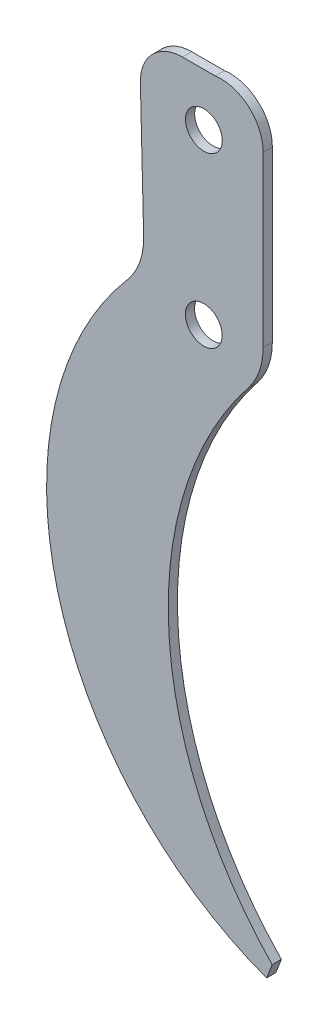
ISO-10303-21;
HEADER;
FILE_DESCRIPTION(('STEP AP214'),'2;1');
FILE_NAME('part.step','',(''),(''),'','','');
FILE_SCHEMA(('AUTOMOTIVE_DESIGN { 1 0 10303 214 1 1 1 1 }'));
ENDSEC;
DATA;
#1=APPLICATION_CONTEXT('core data for automotive mechanical design processes');
#2=APPLICATION_PROTOCOL_DEFINITION('international standard','automotive_design',2000,#1);
#3=PRODUCT_CONTEXT('',#1,'mechanical');
#4=PRODUCT('Part','Part','',(#3));
#5=PRODUCT_RELATED_PRODUCT_CATEGORY('part','',(#4));
#6=PRODUCT_DEFINITION_FORMATION('','',#4);
#7=PRODUCT_DEFINITION_CONTEXT('part definition',#1,'design');
#8=PRODUCT_DEFINITION('design','',#6,#7);
#9=PRODUCT_DEFINITION_SHAPE('','',#8);
#10=(LENGTH_UNIT() NAMED_UNIT(*) SI_UNIT(.MILLI.,.METRE.));
#11=(NAMED_UNIT(*) PLANE_ANGLE_UNIT() SI_UNIT($,.RADIAN.));
#12=(NAMED_UNIT(*) SI_UNIT($,.STERADIAN.) SOLID_ANGLE_UNIT());
#13=UNCERTAINTY_MEASURE_WITH_UNIT(LENGTH_MEASURE(1.E-05),#10,'distance_accuracy_value','');
#14=(GEOMETRIC_REPRESENTATION_CONTEXT(3) GLOBAL_UNCERTAINTY_ASSIGNED_CONTEXT((#13)) GLOBAL_UNIT_ASSIGNED_CONTEXT((#10,
#11,#12)) REPRESENTATION_CONTEXT('',''));
#15=CARTESIAN_POINT('',(0.,0.,0.));
#16=DIRECTION('',(0.,0.,1.));
#17=DIRECTION('',(1.,0.,0.));
#18=AXIS2_PLACEMENT_3D('',#15,#16,#17);
#19=CARTESIAN_POINT('',(7127.77049573772,3294.93047297351,15.));
#20=DIRECTION('',(0.,0.,1.));
#21=DIRECTION('',(1.,0.,0.));
#22=AXIS2_PLACEMENT_3D('',#19,#20,#21);
#23=PLANE('',#22);
#24=CARTESIAN_POINT('',(7127.77049573772,3294.93047297351,15.));
#25=DIRECTION('',(0.,0.,1.));
#26=DIRECTION('',(1.,0.,0.));
#27=AXIS2_PLACEMENT_3D('',#24,#25,#26);
#28=CIRCLE('',#27,549.387659983748);
#29=CARTESIAN_POINT('',(6710.2050521168,3651.95414338778,15.));
#30=VERTEX_POINT('',#29);
#31=CARTESIAN_POINT('',(6936.87895507785,2779.77300127489,15.));
#32=VERTEX_POINT('',#31);
#33=EDGE_CURVE('E162',#30,#32,#28,.T.);
#34=ORIENTED_EDGE('',*,*,#33,.T.);
#35=DIRECTION('',(0.362479633940397,0.931991692547973,0.));
#36=VECTOR('',#35,1.);
#37=CARTESIAN_POINT('',(6945.94094592636,2803.07279358859,15.));
#38=LINE('',#37,#36);
#39=CARTESIAN_POINT('',(6945.94094592636,2803.07279358859,15.));
#40=VERTEX_POINT('',#39);
#41=EDGE_CURVE('E100',#32,#40,#38,.T.);
#42=ORIENTED_EDGE('',*,*,#41,.T.);
#43=CARTESIAN_POINT('',(7380.92244872364,3222.59814605796,15.));
#44=DIRECTION('',(0.,0.,-1.));
#45=DIRECTION('',(1.,0.,0.));
#46=AXIS2_PLACEMENT_3D('',#43,#44,#45);
#47=CIRCLE('',#46,604.326425982123);
#48=CARTESIAN_POINT('',(6907.31914174979,3597.97840228325,15.));
#49=VERTEX_POINT('',#48);
#50=EDGE_CURVE('E183',#40,#49,#47,.T.);
#51=ORIENTED_EDGE('',*,*,#50,.T.);
#52=CARTESIAN_POINT('',(6821.31679547886,3666.36457393798,15.));
#53=DIRECTION('',(0.,0.,1.));
#54=DIRECTION('',(1.,0.,0.));
#55=AXIS2_PLACEMENT_3D('',#52,#53,#54);
#56=CIRCLE('',#55,109.877531996749);
#57=CARTESIAN_POINT('',(6931.19432747561,3666.36457393798,15.));
#58=VERTEX_POINT('',#57);
#59=EDGE_CURVE('E202',#49,#58,#56,.T.);
#60=ORIENTED_EDGE('',*,*,#59,.T.);
#61=DIRECTION('',(0.,1.,0.));
#62=VECTOR('',#61,1.);
#63=CARTESIAN_POINT('',(6931.19432747561,3942.08605991255,15.));
#64=LINE('',#63,#62);
#65=CARTESIAN_POINT('',(6931.19432747561,3942.08605991255,15.));
#66=VERTEX_POINT('',#65);
#67=EDGE_CURVE('E199',#58,#66,#64,.T.);
#68=ORIENTED_EDGE('',*,*,#67,.T.);
#69=CARTESIAN_POINT('',(6862.52400653346,3942.74240313721,15.));
#70=DIRECTION('',(0.,0.,1.));
#71=DIRECTION('',(1.,0.,0.));
#72=AXIS2_PLACEMENT_3D('',#69,#70,#71);
#73=CIRCLE('',#72,68.6734574979682);
#74=CARTESIAN_POINT('',(6853.05215715453,4010.75951741052,15.));
#75=VERTEX_POINT('',#74);
#76=EDGE_CURVE('E201',#66,#75,#73,.T.);
#77=ORIENTED_EDGE('',*,*,#76,.T.);
#78=DIRECTION('',(-1.,0.,0.));
#79=VECTOR('',#78,1.);
#80=CARTESIAN_POINT('',(6799.84646166127,4010.75951741052,15.));
#81=LINE('',#80,#79);
#82=CARTESIAN_POINT('',(6799.84646166127,4010.75951741052,15.));
#83=VERTEX_POINT('',#82);
#84=EDGE_CURVE('E125',#75,#83,#81,.T.);
#85=ORIENTED_EDGE('',*,*,#84,.T.);
#86=CARTESIAN_POINT('',(6799.84646166127,3942.08605991255,15.));
#87=DIRECTION('',(0.,0.,1.));
#88=DIRECTION('',(1.,0.,0.));
#89=AXIS2_PLACEMENT_3D('',#86,#87,#88);
#90=CIRCLE('',#89,68.6734574979682);
#91=CARTESIAN_POINT('',(6731.19432747561,3940.37485084327,15.));
#92=VERTEX_POINT('',#91);
#93=EDGE_CURVE('E119',#83,#92,#90,.T.);
#94=ORIENTED_EDGE('',*,*,#93,.T.);
#95=DIRECTION('',(0.0249180561402347,-0.99968949703305,0.));
#96=VECTOR('',#95,1.);
#97=CARTESIAN_POINT('',(6736.53537808965,3726.09681198145,15.));
#98=LINE('',#97,#96);
#99=CARTESIAN_POINT('',(6736.53537808965,3726.09681198145,15.));
#100=VERTEX_POINT('',#99);
#101=EDGE_CURVE('E123',#92,#100,#98,.T.);
#102=ORIENTED_EDGE('',*,*,#101,.T.);
#103=CARTESIAN_POINT('',(6626.69196339258,3723.3588774706,15.));
#104=DIRECTION('',(0.,0.,-1.));
#105=DIRECTION('',(1.,0.,0.));
#106=AXIS2_PLACEMENT_3D('',#103,#104,#105);
#107=CIRCLE('',#106,109.877531996749);
#108=EDGE_CURVE('E51',#100,#30,#107,.T.);
#109=ORIENTED_EDGE('',*,*,#108,.T.);
#110=EDGE_LOOP('',(#34,#42,#51,#60,#68,#77,#85,#94,#102,#109));
#111=FACE_BOUND('',#110,.T.);
#112=CARTESIAN_POINT('',(6834.46924200168,3650.21863180757,15.));
#113=DIRECTION('',(0.,0.,1.));
#114=DIRECTION('',(1.,0.,0.));
#115=AXIS2_PLACEMENT_3D('',#112,#113,#114);
#116=CIRCLE('',#115,29.9999999999998);
#117=CARTESIAN_POINT('',(6864.46924200168,3650.21863180757,15.));
#118=VERTEX_POINT('',#117);
#119=EDGE_CURVE('E212',#118,#118,#116,.T.);
#120=ORIENTED_EDGE('',*,*,#119,.F.);
#121=EDGE_LOOP('',(#120));
#122=FACE_BOUND('',#121,.T.);
#123=CARTESIAN_POINT('',(6834.63264710738,3925.21863180757,15.));
#124=DIRECTION('',(0.,0.,1.));
#125=DIRECTION('',(1.,0.,0.));
#126=AXIS2_PLACEMENT_3D('',#123,#124,#125);
#127=CIRCLE('',#126,29.9999999999998);
#128=CARTESIAN_POINT('',(6864.63264710738,3925.21863180757,15.));
#129=VERTEX_POINT('',#128);
#130=EDGE_CURVE('E218',#129,#129,#127,.T.);
#131=ORIENTED_EDGE('',*,*,#130,.F.);
#132=EDGE_LOOP('',(#131));
#133=FACE_BOUND('',#132,.T.);
#134=ADVANCED_FACE('F34',(#111,#122,#133),#23,.T.);
#135=CARTESIAN_POINT('',(7127.77049573772,3294.93047297351,0.));
#136=DIRECTION('',(0.,0.,1.));
#137=DIRECTION('',(1.,0.,0.));
#138=AXIS2_PLACEMENT_3D('',#135,#136,#137);
#139=PLANE('',#138);
#140=CARTESIAN_POINT('',(7127.77049573772,3294.93047297351,0.));
#141=DIRECTION('',(0.,0.,1.));
#142=DIRECTION('',(1.,0.,0.));
#143=AXIS2_PLACEMENT_3D('',#140,#141,#142);
#144=CIRCLE('',#143,549.387659983748);
#145=CARTESIAN_POINT('',(6710.2050521168,3651.95414338778,0.));
#146=VERTEX_POINT('',#145);
#147=CARTESIAN_POINT('',(6936.87895507785,2779.77300127489,0.));
#148=VERTEX_POINT('',#147);
#149=EDGE_CURVE('E143',#146,#148,#144,.T.);
#150=ORIENTED_EDGE('',*,*,#149,.F.);
#151=CARTESIAN_POINT('',(6626.69196339258,3723.3588774706,0.));
#152=DIRECTION('',(0.,0.,-1.));
#153=DIRECTION('',(1.,0.,0.));
#154=AXIS2_PLACEMENT_3D('',#151,#152,#153);
#155=CIRCLE('',#154,109.877531996749);
#156=CARTESIAN_POINT('',(6736.53537808965,3726.09681198145,0.));
#157=VERTEX_POINT('',#156);
#158=EDGE_CURVE('E92',#157,#146,#155,.T.);
#159=ORIENTED_EDGE('',*,*,#158,.F.);
#160=DIRECTION('',(0.0249180561402347,-0.99968949703305,0.));
#161=VECTOR('',#160,1.);
#162=CARTESIAN_POINT('',(6736.53537808965,3726.09681198145,0.));
#163=LINE('',#162,#161);
#164=CARTESIAN_POINT('',(6731.19432747561,3940.37485084327,0.));
#165=VERTEX_POINT('',#164);
#166=EDGE_CURVE('E86',#165,#157,#163,.T.);
#167=ORIENTED_EDGE('',*,*,#166,.F.);
#168=CARTESIAN_POINT('',(6799.84646166127,3942.08605991255,0.));
#169=DIRECTION('',(0.,0.,1.));
#170=DIRECTION('',(1.,0.,0.));
#171=AXIS2_PLACEMENT_3D('',#168,#169,#170);
#172=CIRCLE('',#171,68.6734574979682);
#173=CARTESIAN_POINT('',(6799.84646166127,4010.75951741052,0.));
#174=VERTEX_POINT('',#173);
#175=EDGE_CURVE('E133',#174,#165,#172,.T.);
#176=ORIENTED_EDGE('',*,*,#175,.F.);
#177=DIRECTION('',(-1.,0.,0.));
#178=VECTOR('',#177,1.);
#179=CARTESIAN_POINT('',(6799.84646166127,4010.75951741052,0.));
#180=LINE('',#179,#178);
#181=CARTESIAN_POINT('',(6853.05215715453,4010.75951741052,0.));
#182=VERTEX_POINT('',#181);
#183=EDGE_CURVE('E157',#182,#174,#180,.T.);
#184=ORIENTED_EDGE('',*,*,#183,.F.);
#185=CARTESIAN_POINT('',(6862.52400653346,3942.74240313721,0.));
#186=DIRECTION('',(0.,0.,1.));
#187=DIRECTION('',(1.,0.,0.));
#188=AXIS2_PLACEMENT_3D('',#185,#186,#187);
#189=CIRCLE('',#188,68.6734574979682);
#190=CARTESIAN_POINT('',(6931.19432747561,3942.08605991255,0.));
#191=VERTEX_POINT('',#190);
#192=EDGE_CURVE('E155',#191,#182,#189,.T.);
#193=ORIENTED_EDGE('',*,*,#192,.F.);
#194=DIRECTION('',(0.,1.,0.));
#195=VECTOR('',#194,1.);
#196=CARTESIAN_POINT('',(6931.19432747561,3942.08605991255,0.));
#197=LINE('',#196,#195);
#198=CARTESIAN_POINT('',(6931.19432747561,3666.36457393798,0.));
#199=VERTEX_POINT('',#198);
#200=EDGE_CURVE('E153',#199,#191,#197,.T.);
#201=ORIENTED_EDGE('',*,*,#200,.F.);
#202=CARTESIAN_POINT('',(6821.31679547886,3666.36457393798,0.));
#203=DIRECTION('',(0.,0.,1.));
#204=DIRECTION('',(1.,0.,0.));
#205=AXIS2_PLACEMENT_3D('',#202,#203,#204);
#206=CIRCLE('',#205,109.877531996749);
#207=CARTESIAN_POINT('',(6907.31914174979,3597.97840228325,0.));
#208=VERTEX_POINT('',#207);
#209=EDGE_CURVE('E151',#208,#199,#206,.T.);
#210=ORIENTED_EDGE('',*,*,#209,.F.);
#211=CARTESIAN_POINT('',(7380.92244872364,3222.59814605796,0.));
#212=DIRECTION('',(0.,0.,-1.));
#213=DIRECTION('',(1.,0.,0.));
#214=AXIS2_PLACEMENT_3D('',#211,#212,#213);
#215=CIRCLE('',#214,604.326425982123);
#216=CARTESIAN_POINT('',(6945.94094592636,2803.07279358859,0.));
#217=VERTEX_POINT('',#216);
#218=EDGE_CURVE('E149',#217,#208,#215,.T.);
#219=ORIENTED_EDGE('',*,*,#218,.F.);
#220=DIRECTION('',(0.362479633940397,0.931991692547973,0.));
#221=VECTOR('',#220,1.);
#222=CARTESIAN_POINT('',(6945.94094592636,2803.07279358859,0.));
#223=LINE('',#222,#221);
#224=EDGE_CURVE('E146',#148,#217,#223,.T.);
#225=ORIENTED_EDGE('',*,*,#224,.F.);
#226=EDGE_LOOP('',(#150,#159,#167,#176,#184,#193,#201,#210,#219,#225));
#227=FACE_BOUND('',#226,.T.);
#228=CARTESIAN_POINT('',(6834.46924200168,3650.21863180757,0.));
#229=DIRECTION('',(0.,0.,1.));
#230=DIRECTION('',(1.,0.,0.));
#231=AXIS2_PLACEMENT_3D('',#228,#229,#230);
#232=CIRCLE('',#231,29.9999999999998);
#233=CARTESIAN_POINT('',(6864.46924200168,3650.21863180757,0.));
#234=VERTEX_POINT('',#233);
#235=EDGE_CURVE('E147',#234,#234,#232,.F.);
#236=ORIENTED_EDGE('',*,*,#235,.F.);
#237=EDGE_LOOP('',(#236));
#238=FACE_BOUND('',#237,.T.);
#239=CARTESIAN_POINT('',(6834.63264710738,3925.21863180757,0.));
#240=DIRECTION('',(0.,0.,1.));
#241=DIRECTION('',(1.,0.,0.));
#242=AXIS2_PLACEMENT_3D('',#239,#240,#241);
#243=CIRCLE('',#242,29.9999999999998);
#244=CARTESIAN_POINT('',(6864.63264710738,3925.21863180757,0.));
#245=VERTEX_POINT('',#244);
#246=EDGE_CURVE('E215',#245,#245,#243,.F.);
#247=ORIENTED_EDGE('',*,*,#246,.F.);
#248=EDGE_LOOP('',(#247));
#249=FACE_BOUND('',#248,.T.);
#250=ADVANCED_FACE('F187',(#227,#238,#249),#139,.F.);
#251=CARTESIAN_POINT('',(7127.77049573772,3294.93047297351,15.));
#252=DIRECTION('',(0.,0.,-1.));
#253=DIRECTION('',(-1.,0.,0.));
#254=AXIS2_PLACEMENT_3D('',#251,#252,#253);
#255=CYLINDRICAL_SURFACE('',#254,549.387659983748);
#256=ORIENTED_EDGE('',*,*,#149,.T.);
#257=DIRECTION('',(0.,0.,-1.));
#258=VECTOR('',#257,1.);
#259=CARTESIAN_POINT('',(6936.87895507785,2779.77300127489,15.));
#260=LINE('',#259,#258);
#261=EDGE_CURVE('E11',#32,#148,#260,.T.);
#262=ORIENTED_EDGE('',*,*,#261,.F.);
#263=ORIENTED_EDGE('',*,*,#33,.F.);
#264=DIRECTION('',(0.,0.,-1.));
#265=VECTOR('',#264,1.);
#266=CARTESIAN_POINT('',(6710.2050521168,3651.95414338778,15.));
#267=LINE('',#266,#265);
#268=EDGE_CURVE('E139',#30,#146,#267,.T.);
#269=ORIENTED_EDGE('',*,*,#268,.T.);
#270=EDGE_LOOP('',(#256,#262,#263,#269));
#271=FACE_BOUND('',#270,.T.);
#272=ADVANCED_FACE('F36',(#271),#255,.T.);
#273=CARTESIAN_POINT('',(6945.94094592636,2803.07279358859,15.));
#274=DIRECTION('',(-0.931991692547973,0.362479633940397,0.));
#275=DIRECTION('',(-0.362479633940397,-0.931991692547973,0.));
#276=AXIS2_PLACEMENT_3D('',#273,#274,#275);
#277=PLANE('',#276);
#278=ORIENTED_EDGE('',*,*,#224,.T.);
#279=DIRECTION('',(0.,0.,-1.));
#280=VECTOR('',#279,1.);
#281=CARTESIAN_POINT('',(6945.94094592636,2803.07279358859,15.));
#282=LINE('',#281,#280);
#283=EDGE_CURVE('E43',#40,#217,#282,.T.);
#284=ORIENTED_EDGE('',*,*,#283,.F.);
#285=ORIENTED_EDGE('',*,*,#41,.F.);
#286=ORIENTED_EDGE('',*,*,#261,.T.);
#287=EDGE_LOOP('',(#278,#284,#285,#286));
#288=FACE_BOUND('',#287,.T.);
#289=ADVANCED_FACE('F254',(#288),#277,.F.);
#290=CARTESIAN_POINT('',(7380.92244872364,3222.59814605796,15.));
#291=DIRECTION('',(0.,0.,-1.));
#292=DIRECTION('',(-1.,0.,0.));
#293=AXIS2_PLACEMENT_3D('',#290,#291,#292);
#294=CYLINDRICAL_SURFACE('',#293,604.326425982123);
#295=ORIENTED_EDGE('',*,*,#218,.T.);
#296=DIRECTION('',(0.,0.,-1.));
#297=VECTOR('',#296,1.);
#298=CARTESIAN_POINT('',(6907.31914174979,3597.97840228325,15.));
#299=LINE('',#298,#297);
#300=EDGE_CURVE('E175',#49,#208,#299,.T.);
#301=ORIENTED_EDGE('',*,*,#300,.F.);
#302=ORIENTED_EDGE('',*,*,#50,.F.);
#303=ORIENTED_EDGE('',*,*,#283,.T.);
#304=EDGE_LOOP('',(#295,#301,#302,#303));
#305=FACE_BOUND('',#304,.T.);
#306=ADVANCED_FACE('F181',(#305),#294,.F.);
#307=CARTESIAN_POINT('',(6821.31679547886,3666.36457393798,15.));
#308=DIRECTION('',(0.,0.,-1.));
#309=DIRECTION('',(-1.,0.,0.));
#310=AXIS2_PLACEMENT_3D('',#307,#308,#309);
#311=CYLINDRICAL_SURFACE('',#310,109.877531996749);
#312=ORIENTED_EDGE('',*,*,#209,.T.);
#313=DIRECTION('',(0.,0.,-1.));
#314=VECTOR('',#313,1.);
#315=CARTESIAN_POINT('',(6931.19432747561,3666.36457393798,15.));
#316=LINE('',#315,#314);
#317=EDGE_CURVE('E172',#58,#199,#316,.T.);
#318=ORIENTED_EDGE('',*,*,#317,.F.);
#319=ORIENTED_EDGE('',*,*,#59,.F.);
#320=ORIENTED_EDGE('',*,*,#300,.T.);
#321=EDGE_LOOP('',(#312,#318,#319,#320));
#322=FACE_BOUND('',#321,.T.);
#323=ADVANCED_FACE('F193',(#322),#311,.T.);
#324=CARTESIAN_POINT('',(6931.19432747561,3942.08605991255,15.));
#325=DIRECTION('',(-1.,0.,0.));
#326=DIRECTION('',(0.,0.,1.));
#327=AXIS2_PLACEMENT_3D('',#324,#325,#326);
#328=PLANE('',#327);
#329=ORIENTED_EDGE('',*,*,#200,.T.);
#330=DIRECTION('',(0.,0.,-1.));
#331=VECTOR('',#330,1.);
#332=CARTESIAN_POINT('',(6931.19432747561,3942.08605991255,15.));
#333=LINE('',#332,#331);
#334=EDGE_CURVE('E169',#66,#191,#333,.T.);
#335=ORIENTED_EDGE('',*,*,#334,.F.);
#336=ORIENTED_EDGE('',*,*,#67,.F.);
#337=ORIENTED_EDGE('',*,*,#317,.T.);
#338=EDGE_LOOP('',(#329,#335,#336,#337));
#339=FACE_BOUND('',#338,.T.);
#340=ADVANCED_FACE('F197',(#339),#328,.F.);
#341=CARTESIAN_POINT('',(6862.52400653346,3942.74240313721,15.));
#342=DIRECTION('',(0.,0.,-1.));
#343=DIRECTION('',(-1.,0.,0.));
#344=AXIS2_PLACEMENT_3D('',#341,#342,#343);
#345=CYLINDRICAL_SURFACE('',#344,68.6734574979682);
#346=ORIENTED_EDGE('',*,*,#192,.T.);
#347=DIRECTION('',(0.,0.,-1.));
#348=VECTOR('',#347,1.);
#349=CARTESIAN_POINT('',(6853.05215715453,4010.75951741052,15.));
#350=LINE('',#349,#348);
#351=EDGE_CURVE('E166',#75,#182,#350,.T.);
#352=ORIENTED_EDGE('',*,*,#351,.F.);
#353=ORIENTED_EDGE('',*,*,#76,.F.);
#354=ORIENTED_EDGE('',*,*,#334,.T.);
#355=EDGE_LOOP('',(#346,#352,#353,#354));
#356=FACE_BOUND('',#355,.T.);
#357=ADVANCED_FACE('F244',(#356),#345,.T.);
#358=CARTESIAN_POINT('',(6799.84646166127,4010.75951741052,15.));
#359=DIRECTION('',(0.,-1.,0.));
#360=DIRECTION('',(1.,0.,0.));
#361=AXIS2_PLACEMENT_3D('',#358,#359,#360);
#362=PLANE('',#361);
#363=ORIENTED_EDGE('',*,*,#183,.T.);
#364=DIRECTION('',(0.,0.,-1.));
#365=VECTOR('',#364,1.);
#366=CARTESIAN_POINT('',(6799.84646166127,4010.75951741052,15.));
#367=LINE('',#366,#365);
#368=EDGE_CURVE('E134',#83,#174,#367,.T.);
#369=ORIENTED_EDGE('',*,*,#368,.F.);
#370=ORIENTED_EDGE('',*,*,#84,.F.);
#371=ORIENTED_EDGE('',*,*,#351,.T.);
#372=EDGE_LOOP('',(#363,#369,#370,#371));
#373=FACE_BOUND('',#372,.T.);
#374=ADVANCED_FACE('F241',(#373),#362,.F.);
#375=CARTESIAN_POINT('',(6799.84646166127,3942.08605991255,15.));
#376=DIRECTION('',(0.,0.,-1.));
#377=DIRECTION('',(-1.,0.,0.));
#378=AXIS2_PLACEMENT_3D('',#375,#376,#377);
#379=CYLINDRICAL_SURFACE('',#378,68.6734574979682);
#380=ORIENTED_EDGE('',*,*,#175,.T.);
#381=DIRECTION('',(0.,0.,-1.));
#382=VECTOR('',#381,1.);
#383=CARTESIAN_POINT('',(6731.19432747561,3940.37485084327,15.));
#384=LINE('',#383,#382);
#385=EDGE_CURVE('E130',#92,#165,#384,.T.);
#386=ORIENTED_EDGE('',*,*,#385,.F.);
#387=ORIENTED_EDGE('',*,*,#93,.F.);
#388=ORIENTED_EDGE('',*,*,#368,.T.);
#389=EDGE_LOOP('',(#380,#386,#387,#388));
#390=FACE_BOUND('',#389,.T.);
#391=ADVANCED_FACE('F131',(#390),#379,.T.);
#392=CARTESIAN_POINT('',(6736.53537808965,3726.09681198145,15.));
#393=DIRECTION('',(0.99968949703305,0.0249180561402347,0.));
#394=DIRECTION('',(-0.0249180561402347,0.99968949703305,0.));
#395=AXIS2_PLACEMENT_3D('',#392,#393,#394);
#396=PLANE('',#395);
#397=ORIENTED_EDGE('',*,*,#166,.T.);
#398=DIRECTION('',(0.,0.,-1.));
#399=VECTOR('',#398,1.);
#400=CARTESIAN_POINT('',(6736.53537808965,3726.09681198145,15.));
#401=LINE('',#400,#399);
#402=EDGE_CURVE('E135',#100,#157,#401,.T.);
#403=ORIENTED_EDGE('',*,*,#402,.F.);
#404=ORIENTED_EDGE('',*,*,#101,.F.);
#405=ORIENTED_EDGE('',*,*,#385,.T.);
#406=EDGE_LOOP('',(#397,#403,#404,#405));
#407=FACE_BOUND('',#406,.T.);
#408=ADVANCED_FACE('F137',(#407),#396,.F.);
#409=CARTESIAN_POINT('',(6626.69196339258,3723.3588774706,15.));
#410=DIRECTION('',(0.,0.,-1.));
#411=DIRECTION('',(-1.,0.,0.));
#412=AXIS2_PLACEMENT_3D('',#409,#410,#411);
#413=CYLINDRICAL_SURFACE('',#412,109.877531996749);
#414=ORIENTED_EDGE('',*,*,#158,.T.);
#415=ORIENTED_EDGE('',*,*,#268,.F.);
#416=ORIENTED_EDGE('',*,*,#108,.F.);
#417=ORIENTED_EDGE('',*,*,#402,.T.);
#418=EDGE_LOOP('',(#414,#415,#416,#417));
#419=FACE_BOUND('',#418,.T.);
#420=ADVANCED_FACE('F234',(#419),#413,.F.);
#421=CARTESIAN_POINT('',(6834.46924200168,3650.21863180757,-113.137084989848));
#422=DIRECTION('',(0.,0.,1.));
#423=DIRECTION('',(1.,0.,0.));
#424=AXIS2_PLACEMENT_3D('',#421,#422,#423);
#425=CYLINDRICAL_SURFACE('',#424,29.9999999999998);
#426=ORIENTED_EDGE('',*,*,#235,.T.);
#427=EDGE_LOOP('',(#426));
#428=FACE_BOUND('',#427,.T.);
#429=ORIENTED_EDGE('',*,*,#119,.T.);
#430=EDGE_LOOP('',(#429));
#431=FACE_BOUND('',#430,.T.);
#432=ADVANCED_FACE('F231',(#428,#431),#425,.F.);
#433=CARTESIAN_POINT('',(6834.63264710738,3925.21863180757,-113.137084989848));
#434=DIRECTION('',(0.,0.,1.));
#435=DIRECTION('',(1.,0.,0.));
#436=AXIS2_PLACEMENT_3D('',#433,#434,#435);
#437=CYLINDRICAL_SURFACE('',#436,29.9999999999998);
#438=ORIENTED_EDGE('',*,*,#246,.T.);
#439=EDGE_LOOP('',(#438));
#440=FACE_BOUND('',#439,.T.);
#441=ORIENTED_EDGE('',*,*,#130,.T.);
#442=EDGE_LOOP('',(#441));
#443=FACE_BOUND('',#442,.T.);
#444=ADVANCED_FACE('F222',(#440,#443),#437,.F.);
#445=CLOSED_SHELL('',(#134,#250,#272,#289,#306,#323,#340,#357,#374,#391,#408,#420,#432,#444));
#446=MANIFOLD_SOLID_BREP('B2',#445);
#447=ADVANCED_BREP_SHAPE_REPRESENTATION('',(#18,#446),#14);
#448=SHAPE_DEFINITION_REPRESENTATION(#9,#447);
ENDSEC;
END-ISO-10303-21;
